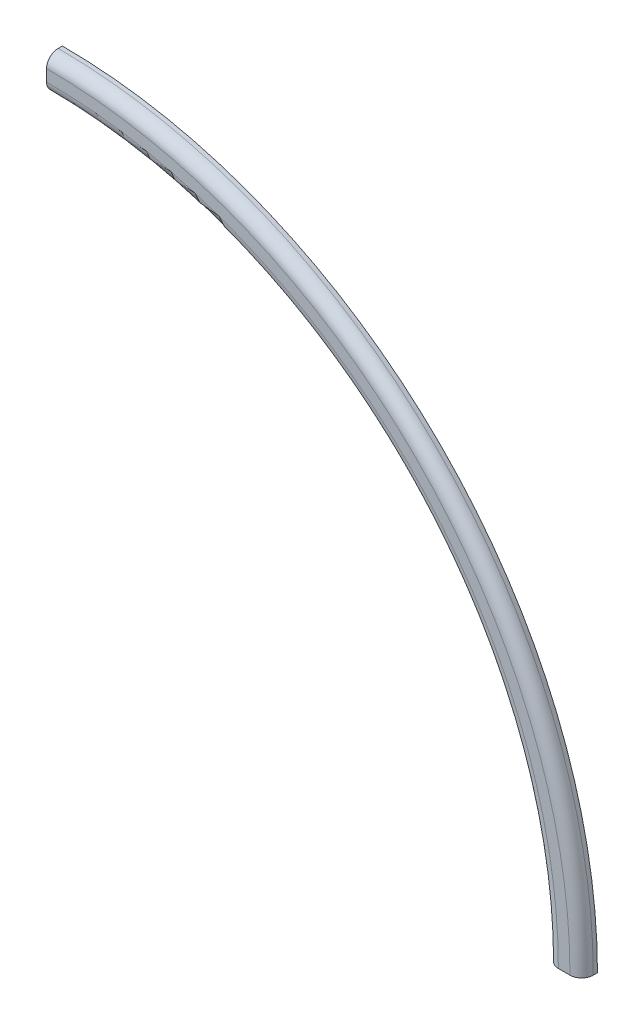
ISO-10303-21;
HEADER;
FILE_DESCRIPTION(('STEP AP214'),'2;1');
FILE_NAME('part.step','',(''),(''),'','','');
FILE_SCHEMA(('AUTOMOTIVE_DESIGN { 1 0 10303 214 1 1 1 1 }'));
ENDSEC;
DATA;
#1=APPLICATION_CONTEXT('core data for automotive mechanical design processes');
#2=APPLICATION_PROTOCOL_DEFINITION('international standard','automotive_design',2000,#1);
#3=PRODUCT_CONTEXT('',#1,'mechanical');
#4=PRODUCT('Part','Part','',(#3));
#5=PRODUCT_RELATED_PRODUCT_CATEGORY('part','',(#4));
#6=PRODUCT_DEFINITION_FORMATION('','',#4);
#7=PRODUCT_DEFINITION_CONTEXT('part definition',#1,'design');
#8=PRODUCT_DEFINITION('design','',#6,#7);
#9=PRODUCT_DEFINITION_SHAPE('','',#8);
#10=(LENGTH_UNIT() NAMED_UNIT(*) SI_UNIT(.MILLI.,.METRE.));
#11=(NAMED_UNIT(*) PLANE_ANGLE_UNIT() SI_UNIT($,.RADIAN.));
#12=(NAMED_UNIT(*) SI_UNIT($,.STERADIAN.) SOLID_ANGLE_UNIT());
#13=UNCERTAINTY_MEASURE_WITH_UNIT(LENGTH_MEASURE(1.E-05),#10,'distance_accuracy_value','');
#14=(GEOMETRIC_REPRESENTATION_CONTEXT(3) GLOBAL_UNCERTAINTY_ASSIGNED_CONTEXT((#13)) GLOBAL_UNIT_ASSIGNED_CONTEXT((#10,
#11,#12)) REPRESENTATION_CONTEXT('',''));
#15=CARTESIAN_POINT('',(0.,0.,0.));
#16=DIRECTION('',(0.,0.,1.));
#17=DIRECTION('',(1.,0.,0.));
#18=AXIS2_PLACEMENT_3D('',#15,#16,#17);
#19=CARTESIAN_POINT('',(0.,0.,17.272));
#20=DIRECTION('',(0.,0.,-1.));
#21=DIRECTION('',(-1.,0.,0.));
#22=AXIS2_PLACEMENT_3D('',#19,#20,#21);
#23=CYLINDRICAL_SURFACE('',#22,584.2);
#24=DIRECTION('',(0.,0.,-1.));
#25=VECTOR('',#24,1.);
#26=CARTESIAN_POINT('',(0.,584.2,17.272));
#27=LINE('',#26,#25);
#28=CARTESIAN_POINT('',(0.,584.2,4.572));
#29=VERTEX_POINT('',#28);
#30=CARTESIAN_POINT('',(0.,584.2,0.));
#31=VERTEX_POINT('',#30);
#32=EDGE_CURVE('E85',#29,#31,#27,.T.);
#33=ORIENTED_EDGE('',*,*,#32,.F.);
#34=CARTESIAN_POINT('',(0.,0.,4.572));
#35=DIRECTION('',(0.,0.,1.));
#36=DIRECTION('',(1.,0.,0.));
#37=AXIS2_PLACEMENT_3D('',#34,#35,#36);
#38=CIRCLE('',#37,584.2);
#39=CARTESIAN_POINT('',(584.2,0.,4.572));
#40=VERTEX_POINT('',#39);
#41=EDGE_CURVE('E56',#29,#40,#38,.F.);
#42=ORIENTED_EDGE('',*,*,#41,.T.);
#43=DIRECTION('',(0.,0.,-1.));
#44=VECTOR('',#43,1.);
#45=CARTESIAN_POINT('',(584.2,0.,17.272));
#46=LINE('',#45,#44);
#47=CARTESIAN_POINT('',(584.2,0.,0.));
#48=VERTEX_POINT('',#47);
#49=EDGE_CURVE('E105',#40,#48,#46,.T.);
#50=ORIENTED_EDGE('',*,*,#49,.T.);
#51=CARTESIAN_POINT('',(0.,0.,0.));
#52=DIRECTION('',(0.,0.,1.));
#53=DIRECTION('',(1.,0.,0.));
#54=AXIS2_PLACEMENT_3D('',#51,#52,#53);
#55=CIRCLE('',#54,584.2);
#56=EDGE_CURVE('E101',#48,#31,#55,.T.);
#57=ORIENTED_EDGE('',*,*,#56,.T.);
#58=EDGE_LOOP('',(#33,#42,#50,#57));
#59=FACE_BOUND('',#58,.T.);
#60=ADVANCED_FACE('F33',(#59),#23,.T.);
#61=CARTESIAN_POINT('',(0.,584.2,17.272));
#62=DIRECTION('',(1.,0.,0.));
#63=DIRECTION('',(0.,1.,0.));
#64=AXIS2_PLACEMENT_3D('',#61,#62,#63);
#65=PLANE('',#64);
#66=DIRECTION('',(0.,-1.,0.));
#67=VECTOR('',#66,1.);
#68=CARTESIAN_POINT('',(0.,584.2,17.272));
#69=LINE('',#68,#67);
#70=CARTESIAN_POINT('',(0.,571.5,17.272));
#71=VERTEX_POINT('',#70);
#72=CARTESIAN_POINT('',(0.,558.8,17.272));
#73=VERTEX_POINT('',#72);
#74=EDGE_CURVE('E115',#71,#73,#69,.T.);
#75=ORIENTED_EDGE('',*,*,#74,.F.);
#76=CARTESIAN_POINT('',(0.,571.5,4.572));
#77=DIRECTION('',(1.,0.,0.));
#78=DIRECTION('',(0.,1.,0.));
#79=AXIS2_PLACEMENT_3D('',#76,#77,#78);
#80=CIRCLE('',#79,12.7);
#81=EDGE_CURVE('E92',#71,#29,#80,.F.);
#82=ORIENTED_EDGE('',*,*,#81,.T.);
#83=ORIENTED_EDGE('',*,*,#32,.T.);
#84=DIRECTION('',(0.,-1.,0.));
#85=VECTOR('',#84,1.);
#86=CARTESIAN_POINT('',(0.,584.2,0.));
#87=LINE('',#86,#85);
#88=CARTESIAN_POINT('',(0.,546.1,0.));
#89=VERTEX_POINT('',#88);
#90=EDGE_CURVE('E90',#31,#89,#87,.T.);
#91=ORIENTED_EDGE('',*,*,#90,.T.);
#92=DIRECTION('',(0.,0.,-1.));
#93=VECTOR('',#92,1.);
#94=CARTESIAN_POINT('',(0.,546.1,17.272));
#95=LINE('',#94,#93);
#96=CARTESIAN_POINT('',(0.,546.1,4.572));
#97=VERTEX_POINT('',#96);
#98=EDGE_CURVE('E95',#97,#89,#95,.T.);
#99=ORIENTED_EDGE('',*,*,#98,.F.);
#100=CARTESIAN_POINT('',(0.,558.8,4.572));
#101=DIRECTION('',(1.,0.,0.));
#102=DIRECTION('',(0.,1.,0.));
#103=AXIS2_PLACEMENT_3D('',#100,#101,#102);
#104=CIRCLE('',#103,12.7);
#105=EDGE_CURVE('E125',#97,#73,#104,.F.);
#106=ORIENTED_EDGE('',*,*,#105,.T.);
#107=EDGE_LOOP('',(#75,#82,#83,#91,#99,#106));
#108=FACE_BOUND('',#107,.T.);
#109=ADVANCED_FACE('F88',(#108),#65,.F.);
#110=CARTESIAN_POINT('',(0.,0.,17.272));
#111=DIRECTION('',(0.,0.,-1.));
#112=DIRECTION('',(-1.,0.,0.));
#113=AXIS2_PLACEMENT_3D('',#110,#111,#112);
#114=CYLINDRICAL_SURFACE('',#113,546.1);
#115=DIRECTION('',(0.,0.,-1.));
#116=VECTOR('',#115,1.);
#117=CARTESIAN_POINT('',(546.1,0.,17.272));
#118=LINE('',#117,#116);
#119=CARTESIAN_POINT('',(546.1,0.,4.572));
#120=VERTEX_POINT('',#119);
#121=CARTESIAN_POINT('',(546.1,0.,0.));
#122=VERTEX_POINT('',#121);
#123=EDGE_CURVE('E117',#120,#122,#118,.T.);
#124=ORIENTED_EDGE('',*,*,#123,.F.);
#125=CARTESIAN_POINT('',(0.,0.,4.572));
#126=DIRECTION('',(0.,0.,1.));
#127=DIRECTION('',(1.,0.,0.));
#128=AXIS2_PLACEMENT_3D('',#125,#126,#127);
#129=CIRCLE('',#128,546.1);
#130=EDGE_CURVE('E11',#120,#97,#129,.T.);
#131=ORIENTED_EDGE('',*,*,#130,.T.);
#132=ORIENTED_EDGE('',*,*,#98,.T.);
#133=CARTESIAN_POINT('',(0.,0.,0.));
#134=DIRECTION('',(0.,0.,-1.));
#135=DIRECTION('',(-1.,0.,0.));
#136=AXIS2_PLACEMENT_3D('',#133,#134,#135);
#137=CIRCLE('',#136,546.1);
#138=EDGE_CURVE('E103',#89,#122,#137,.T.);
#139=ORIENTED_EDGE('',*,*,#138,.T.);
#140=EDGE_LOOP('',(#124,#131,#132,#139));
#141=FACE_BOUND('',#140,.T.);
#142=ADVANCED_FACE('F151',(#141),#114,.F.);
#143=CARTESIAN_POINT('',(584.2,0.,17.272));
#144=DIRECTION('',(0.,1.,0.));
#145=DIRECTION('',(-1.,0.,0.));
#146=AXIS2_PLACEMENT_3D('',#143,#144,#145);
#147=PLANE('',#146);
#148=ORIENTED_EDGE('',*,*,#49,.F.);
#149=CARTESIAN_POINT('',(571.5,0.,4.572));
#150=DIRECTION('',(0.,1.,0.));
#151=DIRECTION('',(-1.,0.,0.));
#152=AXIS2_PLACEMENT_3D('',#149,#150,#151);
#153=CIRCLE('',#152,12.7);
#154=CARTESIAN_POINT('',(571.5,0.,17.272));
#155=VERTEX_POINT('',#154);
#156=EDGE_CURVE('E41',#40,#155,#153,.F.);
#157=ORIENTED_EDGE('',*,*,#156,.T.);
#158=DIRECTION('',(1.,0.,0.));
#159=VECTOR('',#158,1.);
#160=CARTESIAN_POINT('',(584.2,0.,17.272));
#161=LINE('',#160,#159);
#162=CARTESIAN_POINT('',(558.8,0.,17.272));
#163=VERTEX_POINT('',#162);
#164=EDGE_CURVE('E109',#163,#155,#161,.T.);
#165=ORIENTED_EDGE('',*,*,#164,.F.);
#166=CARTESIAN_POINT('',(558.8,0.,4.572));
#167=DIRECTION('',(0.,1.,0.));
#168=DIRECTION('',(-1.,0.,0.));
#169=AXIS2_PLACEMENT_3D('',#166,#167,#168);
#170=CIRCLE('',#169,12.7);
#171=EDGE_CURVE('E48',#163,#120,#170,.F.);
#172=ORIENTED_EDGE('',*,*,#171,.T.);
#173=ORIENTED_EDGE('',*,*,#123,.T.);
#174=DIRECTION('',(1.,0.,0.));
#175=VECTOR('',#174,1.);
#176=CARTESIAN_POINT('',(584.2,0.,0.));
#177=LINE('',#176,#175);
#178=EDGE_CURVE('E113',#122,#48,#177,.T.);
#179=ORIENTED_EDGE('',*,*,#178,.T.);
#180=EDGE_LOOP('',(#148,#157,#165,#172,#173,#179));
#181=FACE_BOUND('',#180,.T.);
#182=ADVANCED_FACE('F131',(#181),#147,.F.);
#183=CARTESIAN_POINT('',(0.,0.,17.272));
#184=DIRECTION('',(0.,0.,1.));
#185=DIRECTION('',(1.,0.,0.));
#186=AXIS2_PLACEMENT_3D('',#183,#184,#185);
#187=PLANE('',#186);
#188=ORIENTED_EDGE('',*,*,#164,.T.);
#189=CARTESIAN_POINT('',(0.,0.,17.272));
#190=DIRECTION('',(0.,0.,1.));
#191=DIRECTION('',(1.,0.,0.));
#192=AXIS2_PLACEMENT_3D('',#189,#190,#191);
#193=CIRCLE('',#192,571.5);
#194=EDGE_CURVE('E122',#155,#71,#193,.T.);
#195=ORIENTED_EDGE('',*,*,#194,.T.);
#196=ORIENTED_EDGE('',*,*,#74,.T.);
#197=CARTESIAN_POINT('',(0.,0.,17.272));
#198=DIRECTION('',(0.,0.,1.));
#199=DIRECTION('',(1.,0.,0.));
#200=AXIS2_PLACEMENT_3D('',#197,#198,#199);
#201=CIRCLE('',#200,558.8);
#202=EDGE_CURVE('E94',#73,#163,#201,.F.);
#203=ORIENTED_EDGE('',*,*,#202,.T.);
#204=EDGE_LOOP('',(#188,#195,#196,#203));
#205=FACE_BOUND('',#204,.T.);
#206=ADVANCED_FACE('F135',(#205),#187,.T.);
#207=CARTESIAN_POINT('',(0.,0.,0.));
#208=DIRECTION('',(0.,0.,1.));
#209=DIRECTION('',(1.,0.,0.));
#210=AXIS2_PLACEMENT_3D('',#207,#208,#209);
#211=PLANE('',#210);
#212=ORIENTED_EDGE('',*,*,#56,.F.);
#213=ORIENTED_EDGE('',*,*,#178,.F.);
#214=ORIENTED_EDGE('',*,*,#138,.F.);
#215=ORIENTED_EDGE('',*,*,#90,.F.);
#216=EDGE_LOOP('',(#212,#213,#214,#215));
#217=FACE_BOUND('',#216,.T.);
#218=ADVANCED_FACE('F99',(#217),#211,.F.);
#219=CARTESIAN_POINT('',(0.,0.,4.572));
#220=DIRECTION('',(0.,0.,1.));
#221=DIRECTION('',(1.,0.,0.));
#222=AXIS2_PLACEMENT_3D('',#219,#220,#221);
#223=TOROIDAL_SURFACE('',#222,571.5,12.7);
#224=ORIENTED_EDGE('',*,*,#156,.F.);
#225=ORIENTED_EDGE('',*,*,#41,.F.);
#226=ORIENTED_EDGE('',*,*,#81,.F.);
#227=ORIENTED_EDGE('',*,*,#194,.F.);
#228=EDGE_LOOP('',(#224,#225,#226,#227));
#229=FACE_BOUND('',#228,.T.);
#230=ADVANCED_FACE('F138',(#229),#223,.T.);
#231=CARTESIAN_POINT('',(0.,0.,4.572));
#232=DIRECTION('',(0.,0.,1.));
#233=DIRECTION('',(1.,0.,0.));
#234=AXIS2_PLACEMENT_3D('',#231,#232,#233);
#235=TOROIDAL_SURFACE('',#234,558.8,12.7);
#236=ORIENTED_EDGE('',*,*,#105,.F.);
#237=ORIENTED_EDGE('',*,*,#130,.F.);
#238=ORIENTED_EDGE('',*,*,#171,.F.);
#239=ORIENTED_EDGE('',*,*,#202,.F.);
#240=EDGE_LOOP('',(#236,#237,#238,#239));
#241=FACE_BOUND('',#240,.T.);
#242=ADVANCED_FACE('F35',(#241),#235,.T.);
#243=CLOSED_SHELL('',(#60,#109,#142,#182,#206,#218,#230,#242));
#244=MANIFOLD_SOLID_BREP('B2',#243);
#245=ADVANCED_BREP_SHAPE_REPRESENTATION('',(#18,#244),#14);
#246=SHAPE_DEFINITION_REPRESENTATION(#9,#245);
ENDSEC;
END-ISO-10303-21;
